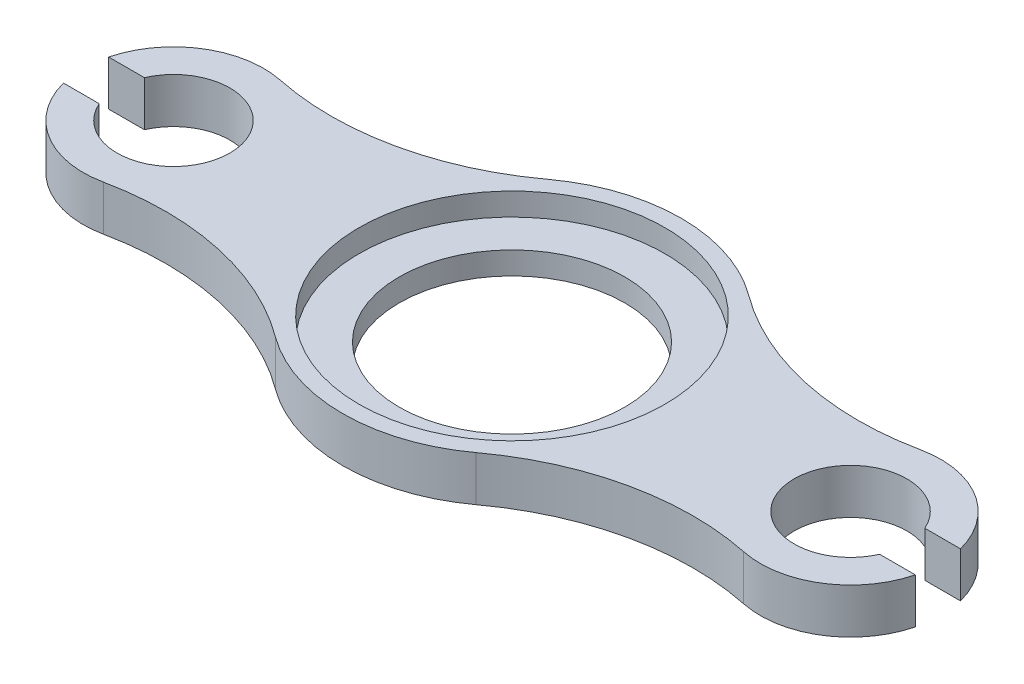
ISO-10303-21;
HEADER;
FILE_DESCRIPTION(('STEP AP214'),'2;1');
FILE_NAME('part.step','',(''),(''),'','','');
FILE_SCHEMA(('AUTOMOTIVE_DESIGN { 1 0 10303 214 1 1 1 1 }'));
ENDSEC;
DATA;
#1=APPLICATION_CONTEXT('core data for automotive mechanical design processes');
#2=APPLICATION_PROTOCOL_DEFINITION('international standard','automotive_design',2000,#1);
#3=PRODUCT_CONTEXT('',#1,'mechanical');
#4=PRODUCT('Part','Part','',(#3));
#5=PRODUCT_RELATED_PRODUCT_CATEGORY('part','',(#4));
#6=PRODUCT_DEFINITION_FORMATION('','',#4);
#7=PRODUCT_DEFINITION_CONTEXT('part definition',#1,'design');
#8=PRODUCT_DEFINITION('design','',#6,#7);
#9=PRODUCT_DEFINITION_SHAPE('','',#8);
#10=(LENGTH_UNIT() NAMED_UNIT(*) SI_UNIT(.MILLI.,.METRE.));
#11=(NAMED_UNIT(*) PLANE_ANGLE_UNIT() SI_UNIT($,.RADIAN.));
#12=(NAMED_UNIT(*) SI_UNIT($,.STERADIAN.) SOLID_ANGLE_UNIT());
#13=UNCERTAINTY_MEASURE_WITH_UNIT(LENGTH_MEASURE(1.E-05),#10,'distance_accuracy_value','');
#14=(GEOMETRIC_REPRESENTATION_CONTEXT(3) GLOBAL_UNCERTAINTY_ASSIGNED_CONTEXT((#13)) GLOBAL_UNIT_ASSIGNED_CONTEXT((#10,
#11,#12)) REPRESENTATION_CONTEXT('',''));
#15=CARTESIAN_POINT('',(0.,0.,0.));
#16=DIRECTION('',(0.,0.,1.));
#17=DIRECTION('',(1.,0.,0.));
#18=AXIS2_PLACEMENT_3D('',#15,#16,#17);
#19=CARTESIAN_POINT('',(-150.,20.,0.));
#20=DIRECTION('',(0.,-1.,0.));
#21=DIRECTION('',(0.,0.,-1.));
#22=AXIS2_PLACEMENT_3D('',#19,#20,#21);
#23=CYLINDRICAL_SURFACE('',#22,40.);
#24=CARTESIAN_POINT('',(-150.,0.,0.));
#25=DIRECTION('',(0.,1.,0.));
#26=DIRECTION('',(0.,0.,1.));
#27=AXIS2_PLACEMENT_3D('',#24,#25,#26);
#28=CIRCLE('',#27,40.);
#29=CARTESIAN_POINT('',(-141.825379967554,0.,-39.1557861282996));
#30=VERTEX_POINT('',#29);
#31=CARTESIAN_POINT('',(-188.729833462074,0.,-10.));
#32=VERTEX_POINT('',#31);
#33=EDGE_CURVE('E281',#30,#32,#28,.T.);
#34=ORIENTED_EDGE('',*,*,#33,.T.);
#35=DIRECTION('',(0.,-1.,0.));
#36=VECTOR('',#35,1.);
#37=CARTESIAN_POINT('',(-188.729833462074,20.,-10.));
#38=LINE('',#37,#36);
#39=CARTESIAN_POINT('',(-188.729833462074,20.,-10.));
#40=VERTEX_POINT('',#39);
#41=EDGE_CURVE('E99',#40,#32,#38,.T.);
#42=ORIENTED_EDGE('',*,*,#41,.F.);
#43=CARTESIAN_POINT('',(-150.,20.,0.));
#44=DIRECTION('',(0.,1.,0.));
#45=DIRECTION('',(0.,0.,1.));
#46=AXIS2_PLACEMENT_3D('',#43,#44,#45);
#47=CIRCLE('',#46,40.);
#48=CARTESIAN_POINT('',(-141.825379967554,20.,-39.1557861282996));
#49=VERTEX_POINT('',#48);
#50=EDGE_CURVE('E262',#49,#40,#47,.T.);
#51=ORIENTED_EDGE('',*,*,#50,.F.);
#52=DIRECTION('',(0.,-1.,0.));
#53=VECTOR('',#52,1.);
#54=CARTESIAN_POINT('',(-141.825379967554,20.,-39.1557861282996));
#55=LINE('',#54,#53);
#56=EDGE_CURVE('E12',#49,#30,#55,.T.);
#57=ORIENTED_EDGE('',*,*,#56,.T.);
#58=EDGE_LOOP('',(#34,#42,#51,#57));
#59=FACE_BOUND('',#58,.T.);
#60=ADVANCED_FACE('F89',(#59),#23,.T.);
#61=CARTESIAN_POINT('',(0.,20.,-10.));
#62=DIRECTION('',(0.,0.,-1.));
#63=DIRECTION('',(-1.,0.,0.));
#64=AXIS2_PLACEMENT_3D('',#61,#62,#63);
#65=PLANE('',#64);
#66=DIRECTION('',(1.,0.,0.));
#67=VECTOR('',#66,1.);
#68=CARTESIAN_POINT('',(0.,0.,-10.));
#69=LINE('',#68,#67);
#70=CARTESIAN_POINT('',(-172.912878474779,0.,-10.));
#71=VERTEX_POINT('',#70);
#72=EDGE_CURVE('E283',#32,#71,#69,.T.);
#73=ORIENTED_EDGE('',*,*,#72,.T.);
#74=DIRECTION('',(0.,-1.,0.));
#75=VECTOR('',#74,1.);
#76=CARTESIAN_POINT('',(-172.912878474779,20.,-10.));
#77=LINE('',#76,#75);
#78=CARTESIAN_POINT('',(-172.912878474779,20.,-10.));
#79=VERTEX_POINT('',#78);
#80=EDGE_CURVE('E306',#79,#71,#77,.T.);
#81=ORIENTED_EDGE('',*,*,#80,.F.);
#82=DIRECTION('',(1.,0.,0.));
#83=VECTOR('',#82,1.);
#84=CARTESIAN_POINT('',(0.,20.,-10.));
#85=LINE('',#84,#83);
#86=EDGE_CURVE('E266',#40,#79,#85,.T.);
#87=ORIENTED_EDGE('',*,*,#86,.F.);
#88=ORIENTED_EDGE('',*,*,#41,.T.);
#89=EDGE_LOOP('',(#73,#81,#87,#88));
#90=FACE_BOUND('',#89,.T.);
#91=ADVANCED_FACE('F375',(#90),#65,.F.);
#92=CARTESIAN_POINT('',(-150.,20.,0.));
#93=DIRECTION('',(0.,-1.,0.));
#94=DIRECTION('',(0.,0.,-1.));
#95=AXIS2_PLACEMENT_3D('',#92,#93,#94);
#96=CYLINDRICAL_SURFACE('',#95,25.);
#97=CARTESIAN_POINT('',(-150.,0.,0.));
#98=DIRECTION('',(0.,1.,0.));
#99=DIRECTION('',(0.,0.,1.));
#100=AXIS2_PLACEMENT_3D('',#97,#98,#99);
#101=CIRCLE('',#100,25.);
#102=CARTESIAN_POINT('',(-172.912878474779,0.,10.));
#103=VERTEX_POINT('',#102);
#104=EDGE_CURVE('E286',#103,#71,#101,.T.);
#105=ORIENTED_EDGE('',*,*,#104,.F.);
#106=DIRECTION('',(0.,-1.,0.));
#107=VECTOR('',#106,1.);
#108=CARTESIAN_POINT('',(-172.912878474779,20.,10.));
#109=LINE('',#108,#107);
#110=CARTESIAN_POINT('',(-172.912878474779,20.,10.));
#111=VERTEX_POINT('',#110);
#112=EDGE_CURVE('E304',#111,#103,#109,.T.);
#113=ORIENTED_EDGE('',*,*,#112,.F.);
#114=CARTESIAN_POINT('',(-150.,20.,0.));
#115=DIRECTION('',(0.,1.,0.));
#116=DIRECTION('',(0.,0.,1.));
#117=AXIS2_PLACEMENT_3D('',#114,#115,#116);
#118=CIRCLE('',#117,25.);
#119=EDGE_CURVE('E269',#111,#79,#118,.T.);
#120=ORIENTED_EDGE('',*,*,#119,.T.);
#121=ORIENTED_EDGE('',*,*,#80,.T.);
#122=EDGE_LOOP('',(#105,#113,#120,#121));
#123=FACE_BOUND('',#122,.T.);
#124=ADVANCED_FACE('F379',(#123),#96,.F.);
#125=CARTESIAN_POINT('',(0.,20.,10.));
#126=DIRECTION('',(0.,0.,-1.));
#127=DIRECTION('',(-1.,0.,0.));
#128=AXIS2_PLACEMENT_3D('',#125,#126,#127);
#129=PLANE('',#128);
#130=DIRECTION('',(1.,0.,0.));
#131=VECTOR('',#130,1.);
#132=CARTESIAN_POINT('',(0.,0.,10.));
#133=LINE('',#132,#131);
#134=CARTESIAN_POINT('',(-188.729833462074,0.,10.));
#135=VERTEX_POINT('',#134);
#136=EDGE_CURVE('E289',#135,#103,#133,.T.);
#137=ORIENTED_EDGE('',*,*,#136,.F.);
#138=DIRECTION('',(0.,-1.,0.));
#139=VECTOR('',#138,1.);
#140=CARTESIAN_POINT('',(-188.729833462074,20.,10.));
#141=LINE('',#140,#139);
#142=CARTESIAN_POINT('',(-188.729833462074,20.,10.));
#143=VERTEX_POINT('',#142);
#144=EDGE_CURVE('E302',#143,#135,#141,.T.);
#145=ORIENTED_EDGE('',*,*,#144,.F.);
#146=DIRECTION('',(1.,0.,0.));
#147=VECTOR('',#146,1.);
#148=CARTESIAN_POINT('',(0.,20.,10.));
#149=LINE('',#148,#147);
#150=EDGE_CURVE('E272',#143,#111,#149,.T.);
#151=ORIENTED_EDGE('',*,*,#150,.T.);
#152=ORIENTED_EDGE('',*,*,#112,.T.);
#153=EDGE_LOOP('',(#137,#145,#151,#152));
#154=FACE_BOUND('',#153,.T.);
#155=ADVANCED_FACE('F382',(#154),#129,.T.);
#156=CARTESIAN_POINT('',(-150.,20.,0.));
#157=DIRECTION('',(0.,-1.,0.));
#158=DIRECTION('',(0.,0.,-1.));
#159=AXIS2_PLACEMENT_3D('',#156,#157,#158);
#160=CYLINDRICAL_SURFACE('',#159,40.);
#161=CARTESIAN_POINT('',(-150.,0.,0.));
#162=DIRECTION('',(0.,1.,0.));
#163=DIRECTION('',(0.,0.,1.));
#164=AXIS2_PLACEMENT_3D('',#161,#162,#163);
#165=CIRCLE('',#164,40.);
#166=CARTESIAN_POINT('',(-141.825379967554,0.,39.1557861282996));
#167=VERTEX_POINT('',#166);
#168=EDGE_CURVE('E292',#135,#167,#165,.T.);
#169=ORIENTED_EDGE('',*,*,#168,.T.);
#170=DIRECTION('',(0.,-1.,0.));
#171=VECTOR('',#170,1.);
#172=CARTESIAN_POINT('',(-141.825379967554,20.,39.1557861282996));
#173=LINE('',#172,#171);
#174=CARTESIAN_POINT('',(-141.825379967554,20.,39.1557861282996));
#175=VERTEX_POINT('',#174);
#176=EDGE_CURVE('E299',#175,#167,#173,.T.);
#177=ORIENTED_EDGE('',*,*,#176,.F.);
#178=CARTESIAN_POINT('',(-150.,20.,0.));
#179=DIRECTION('',(0.,1.,0.));
#180=DIRECTION('',(0.,0.,1.));
#181=AXIS2_PLACEMENT_3D('',#178,#179,#180);
#182=CIRCLE('',#181,40.);
#183=EDGE_CURVE('E275',#143,#175,#182,.T.);
#184=ORIENTED_EDGE('',*,*,#183,.F.);
#185=ORIENTED_EDGE('',*,*,#144,.T.);
#186=EDGE_LOOP('',(#169,#177,#184,#185));
#187=FACE_BOUND('',#186,.T.);
#188=ADVANCED_FACE('F385',(#187),#160,.T.);
#189=CARTESIAN_POINT('',(-116.888373994603,20.,158.602080718323));
#190=DIRECTION('',(0.,-1.,0.));
#191=DIRECTION('',(0.,0.,-1.));
#192=AXIS2_PLACEMENT_3D('',#189,#190,#191);
#193=CYLINDRICAL_SURFACE('',#192,122.021602834014);
#194=CARTESIAN_POINT('',(-116.888373994603,0.,158.602080718323));
#195=DIRECTION('',(0.,1.,0.));
#196=DIRECTION('',(0.,0.,1.));
#197=AXIS2_PLACEMENT_3D('',#194,#195,#196);
#198=CIRCLE('',#197,122.021602834014);
#199=CARTESIAN_POINT('',(-44.4957706337458,0.,60.3748821589664));
#200=VERTEX_POINT('',#199);
#201=EDGE_CURVE('E263',#167,#200,#198,.F.);
#202=ORIENTED_EDGE('',*,*,#201,.T.);
#203=DIRECTION('',(0.,-1.,0.));
#204=VECTOR('',#203,1.);
#205=CARTESIAN_POINT('',(-44.4957706337458,20.,60.3748821589664));
#206=LINE('',#205,#204);
#207=CARTESIAN_POINT('',(-44.4957706337458,20.,60.3748821589664));
#208=VERTEX_POINT('',#207);
#209=EDGE_CURVE('E297',#208,#200,#206,.T.);
#210=ORIENTED_EDGE('',*,*,#209,.F.);
#211=CARTESIAN_POINT('',(-116.888373994603,20.,158.602080718323));
#212=DIRECTION('',(0.,1.,0.));
#213=DIRECTION('',(0.,0.,1.));
#214=AXIS2_PLACEMENT_3D('',#211,#212,#213);
#215=CIRCLE('',#214,122.021602834014);
#216=EDGE_CURVE('E278',#175,#208,#215,.F.);
#217=ORIENTED_EDGE('',*,*,#216,.F.);
#218=ORIENTED_EDGE('',*,*,#176,.T.);
#219=EDGE_LOOP('',(#202,#210,#217,#218));
#220=FACE_BOUND('',#219,.T.);
#221=ADVANCED_FACE('F351',(#220),#193,.F.);
#222=CARTESIAN_POINT('',(-116.888373994603,20.,-158.602080718323));
#223=DIRECTION('',(0.,-1.,0.));
#224=DIRECTION('',(0.,0.,-1.));
#225=AXIS2_PLACEMENT_3D('',#222,#223,#224);
#226=CYLINDRICAL_SURFACE('',#225,122.021602834014);
#227=CARTESIAN_POINT('',(-116.888373994603,0.,-158.602080718323));
#228=DIRECTION('',(0.,1.,0.));
#229=DIRECTION('',(0.,0.,1.));
#230=AXIS2_PLACEMENT_3D('',#227,#228,#229);
#231=CIRCLE('',#230,122.021602834014);
#232=CARTESIAN_POINT('',(-44.4957706337458,0.,-60.3748821589664));
#233=VERTEX_POINT('',#232);
#234=EDGE_CURVE('E235',#30,#233,#231,.T.);
#235=ORIENTED_EDGE('',*,*,#234,.F.);
#236=ORIENTED_EDGE('',*,*,#56,.F.);
#237=CARTESIAN_POINT('',(-116.888373994603,20.,-158.602080718323));
#238=DIRECTION('',(0.,1.,0.));
#239=DIRECTION('',(0.,0.,1.));
#240=AXIS2_PLACEMENT_3D('',#237,#238,#239);
#241=CIRCLE('',#240,122.021602834014);
#242=CARTESIAN_POINT('',(-44.4957706337458,20.,-60.3748821589664));
#243=VERTEX_POINT('',#242);
#244=EDGE_CURVE('E260',#49,#243,#241,.T.);
#245=ORIENTED_EDGE('',*,*,#244,.T.);
#246=DIRECTION('',(0.,-1.,0.));
#247=VECTOR('',#246,1.);
#248=CARTESIAN_POINT('',(-44.4957706337458,20.,-60.3748821589664));
#249=LINE('',#248,#247);
#250=EDGE_CURVE('E108',#243,#233,#249,.T.);
#251=ORIENTED_EDGE('',*,*,#250,.T.);
#252=EDGE_LOOP('',(#235,#236,#245,#251));
#253=FACE_BOUND('',#252,.T.);
#254=ADVANCED_FACE('F367',(#253),#226,.F.);
#255=CARTESIAN_POINT('',(0.,0.,0.));
#256=DIRECTION('',(0.,1.,0.));
#257=DIRECTION('',(0.,0.,1.));
#258=AXIS2_PLACEMENT_3D('',#255,#256,#257);
#259=PLANE('',#258);
#260=CARTESIAN_POINT('',(0.,0.,0.));
#261=DIRECTION('',(0.,1.,0.));
#262=DIRECTION('',(0.,0.,1.));
#263=AXIS2_PLACEMENT_3D('',#260,#261,#262);
#264=CIRCLE('',#263,50.);
#265=CARTESIAN_POINT('',(0.,0.,50.));
#266=VERTEX_POINT('',#265);
#267=EDGE_CURVE('E567',#266,#266,#264,.T.);
#268=ORIENTED_EDGE('',*,*,#267,.T.);
#269=EDGE_LOOP('',(#268));
#270=FACE_BOUND('',#269,.T.);
#271=ORIENTED_EDGE('',*,*,#234,.T.);
#272=CARTESIAN_POINT('',(0.,0.,0.));
#273=DIRECTION('',(0.,1.,0.));
#274=DIRECTION('',(0.,0.,1.));
#275=AXIS2_PLACEMENT_3D('',#272,#273,#274);
#276=CIRCLE('',#275,75.);
#277=CARTESIAN_POINT('',(44.4957706337458,0.,-60.3748821589664));
#278=VERTEX_POINT('',#277);
#279=EDGE_CURVE('E93',#278,#233,#276,.T.);
#280=ORIENTED_EDGE('',*,*,#279,.F.);
#281=CARTESIAN_POINT('',(116.888373994603,0.,-158.602080718323));
#282=DIRECTION('',(0.,1.,0.));
#283=DIRECTION('',(0.,0.,1.));
#284=AXIS2_PLACEMENT_3D('',#281,#282,#283);
#285=CIRCLE('',#284,122.021602834014);
#286=CARTESIAN_POINT('',(141.825379967554,0.,-39.1557861282996));
#287=VERTEX_POINT('',#286);
#288=EDGE_CURVE('E209',#287,#278,#285,.F.);
#289=ORIENTED_EDGE('',*,*,#288,.F.);
#290=CARTESIAN_POINT('',(150.,0.,0.));
#291=DIRECTION('',(0.,1.,0.));
#292=DIRECTION('',(0.,0.,1.));
#293=AXIS2_PLACEMENT_3D('',#290,#291,#292);
#294=CIRCLE('',#293,40.);
#295=CARTESIAN_POINT('',(188.729833462074,0.,-10.0000000000001));
#296=VERTEX_POINT('',#295);
#297=EDGE_CURVE('E194',#287,#296,#294,.F.);
#298=ORIENTED_EDGE('',*,*,#297,.T.);
#299=DIRECTION('',(-1.,0.,0.));
#300=VECTOR('',#299,1.);
#301=CARTESIAN_POINT('',(0.,0.,-10.0000000000001));
#302=LINE('',#301,#300);
#303=CARTESIAN_POINT('',(172.912878474779,0.,-10.0000000000001));
#304=VERTEX_POINT('',#303);
#305=EDGE_CURVE('E206',#296,#304,#302,.T.);
#306=ORIENTED_EDGE('',*,*,#305,.T.);
#307=CARTESIAN_POINT('',(150.,0.,0.));
#308=DIRECTION('',(0.,1.,0.));
#309=DIRECTION('',(0.,0.,1.));
#310=AXIS2_PLACEMENT_3D('',#307,#308,#309);
#311=CIRCLE('',#310,25.);
#312=CARTESIAN_POINT('',(172.912878474779,0.,9.99999999999994));
#313=VERTEX_POINT('',#312);
#314=EDGE_CURVE('E213',#313,#304,#311,.F.);
#315=ORIENTED_EDGE('',*,*,#314,.F.);
#316=DIRECTION('',(-1.,0.,0.));
#317=VECTOR('',#316,1.);
#318=CARTESIAN_POINT('',(0.,0.,9.99999999999994));
#319=LINE('',#318,#317);
#320=CARTESIAN_POINT('',(188.729833462074,0.,9.99999999999994));
#321=VERTEX_POINT('',#320);
#322=EDGE_CURVE('E217',#321,#313,#319,.T.);
#323=ORIENTED_EDGE('',*,*,#322,.F.);
#324=CARTESIAN_POINT('',(150.,0.,0.));
#325=DIRECTION('',(0.,1.,0.));
#326=DIRECTION('',(0.,0.,1.));
#327=AXIS2_PLACEMENT_3D('',#324,#325,#326);
#328=CIRCLE('',#327,40.);
#329=CARTESIAN_POINT('',(141.825379967554,0.,39.1557861282996));
#330=VERTEX_POINT('',#329);
#331=EDGE_CURVE('E326',#321,#330,#328,.F.);
#332=ORIENTED_EDGE('',*,*,#331,.T.);
#333=CARTESIAN_POINT('',(116.888373994603,0.,158.602080718323));
#334=DIRECTION('',(0.,1.,0.));
#335=DIRECTION('',(0.,0.,1.));
#336=AXIS2_PLACEMENT_3D('',#333,#334,#335);
#337=CIRCLE('',#336,122.021602834014);
#338=CARTESIAN_POINT('',(44.4957706337458,0.,60.3748821589664));
#339=VERTEX_POINT('',#338);
#340=EDGE_CURVE('E323',#330,#339,#337,.T.);
#341=ORIENTED_EDGE('',*,*,#340,.T.);
#342=EDGE_CURVE('E245',#200,#339,#276,.T.);
#343=ORIENTED_EDGE('',*,*,#342,.F.);
#344=ORIENTED_EDGE('',*,*,#201,.F.);
#345=ORIENTED_EDGE('',*,*,#168,.F.);
#346=ORIENTED_EDGE('',*,*,#136,.T.);
#347=ORIENTED_EDGE('',*,*,#104,.T.);
#348=ORIENTED_EDGE('',*,*,#72,.F.);
#349=ORIENTED_EDGE('',*,*,#33,.F.);
#350=EDGE_LOOP('',(#271,#280,#289,#298,#306,#315,#323,#332,#341,#343,#344,#345,#346,#347,#348,#349));
#351=FACE_BOUND('',#350,.T.);
#352=ADVANCED_FACE('F204',(#270,#351),#259,.F.);
#353=CARTESIAN_POINT('',(0.,20.,0.));
#354=DIRECTION('',(0.,1.,0.));
#355=DIRECTION('',(0.,0.,1.));
#356=AXIS2_PLACEMENT_3D('',#353,#354,#355);
#357=PLANE('',#356);
#358=CARTESIAN_POINT('',(0.,20.,0.));
#359=DIRECTION('',(0.,1.,0.));
#360=DIRECTION('',(0.,0.,1.));
#361=AXIS2_PLACEMENT_3D('',#358,#359,#360);
#362=CIRCLE('',#361,67.8);
#363=CARTESIAN_POINT('',(0.,20.,67.8));
#364=VERTEX_POINT('',#363);
#365=EDGE_CURVE('E250',#364,#364,#362,.T.);
#366=ORIENTED_EDGE('',*,*,#365,.F.);
#367=EDGE_LOOP('',(#366));
#368=FACE_BOUND('',#367,.T.);
#369=ORIENTED_EDGE('',*,*,#244,.F.);
#370=ORIENTED_EDGE('',*,*,#50,.T.);
#371=ORIENTED_EDGE('',*,*,#86,.T.);
#372=ORIENTED_EDGE('',*,*,#119,.F.);
#373=ORIENTED_EDGE('',*,*,#150,.F.);
#374=ORIENTED_EDGE('',*,*,#183,.T.);
#375=ORIENTED_EDGE('',*,*,#216,.T.);
#376=CARTESIAN_POINT('',(0.,20.,0.));
#377=DIRECTION('',(0.,1.,0.));
#378=DIRECTION('',(0.,0.,1.));
#379=AXIS2_PLACEMENT_3D('',#376,#377,#378);
#380=CIRCLE('',#379,75.);
#381=CARTESIAN_POINT('',(44.4957706337458,20.,60.3748821589664));
#382=VERTEX_POINT('',#381);
#383=EDGE_CURVE('E236',#208,#382,#380,.T.);
#384=ORIENTED_EDGE('',*,*,#383,.T.);
#385=CARTESIAN_POINT('',(116.888373994603,20.,158.602080718323));
#386=DIRECTION('',(0.,1.,0.));
#387=DIRECTION('',(0.,0.,1.));
#388=AXIS2_PLACEMENT_3D('',#385,#386,#387);
#389=CIRCLE('',#388,122.021602834014);
#390=CARTESIAN_POINT('',(141.825379967554,20.,39.1557861282996));
#391=VERTEX_POINT('',#390);
#392=EDGE_CURVE('E311',#391,#382,#389,.T.);
#393=ORIENTED_EDGE('',*,*,#392,.F.);
#394=CARTESIAN_POINT('',(150.,20.,0.));
#395=DIRECTION('',(0.,1.,0.));
#396=DIRECTION('',(0.,0.,1.));
#397=AXIS2_PLACEMENT_3D('',#394,#395,#396);
#398=CIRCLE('',#397,40.);
#399=CARTESIAN_POINT('',(188.729833462074,20.,9.99999999999994));
#400=VERTEX_POINT('',#399);
#401=EDGE_CURVE('E314',#400,#391,#398,.F.);
#402=ORIENTED_EDGE('',*,*,#401,.F.);
#403=DIRECTION('',(-1.,0.,0.));
#404=VECTOR('',#403,1.);
#405=CARTESIAN_POINT('',(0.,20.,9.99999999999994));
#406=LINE('',#405,#404);
#407=CARTESIAN_POINT('',(172.912878474779,20.,9.99999999999994));
#408=VERTEX_POINT('',#407);
#409=EDGE_CURVE('E317',#400,#408,#406,.T.);
#410=ORIENTED_EDGE('',*,*,#409,.T.);
#411=CARTESIAN_POINT('',(150.,20.,0.));
#412=DIRECTION('',(0.,1.,0.));
#413=DIRECTION('',(0.,0.,1.));
#414=AXIS2_PLACEMENT_3D('',#411,#412,#413);
#415=CIRCLE('',#414,25.);
#416=CARTESIAN_POINT('',(172.912878474779,20.,-10.0000000000001));
#417=VERTEX_POINT('',#416);
#418=EDGE_CURVE('E319',#408,#417,#415,.F.);
#419=ORIENTED_EDGE('',*,*,#418,.T.);
#420=DIRECTION('',(-1.,0.,0.));
#421=VECTOR('',#420,1.);
#422=CARTESIAN_POINT('',(0.,20.,-10.0000000000001));
#423=LINE('',#422,#421);
#424=CARTESIAN_POINT('',(188.729833462074,20.,-10.0000000000001));
#425=VERTEX_POINT('',#424);
#426=EDGE_CURVE('E198',#425,#417,#423,.T.);
#427=ORIENTED_EDGE('',*,*,#426,.F.);
#428=CARTESIAN_POINT('',(150.,20.,0.));
#429=DIRECTION('',(0.,1.,0.));
#430=DIRECTION('',(0.,0.,1.));
#431=AXIS2_PLACEMENT_3D('',#428,#429,#430);
#432=CIRCLE('',#431,40.);
#433=CARTESIAN_POINT('',(141.825379967554,20.,-39.1557861282996));
#434=VERTEX_POINT('',#433);
#435=EDGE_CURVE('E196',#434,#425,#432,.F.);
#436=ORIENTED_EDGE('',*,*,#435,.F.);
#437=CARTESIAN_POINT('',(116.888373994603,20.,-158.602080718323));
#438=DIRECTION('',(0.,1.,0.));
#439=DIRECTION('',(0.,0.,1.));
#440=AXIS2_PLACEMENT_3D('',#437,#438,#439);
#441=CIRCLE('',#440,122.021602834014);
#442=CARTESIAN_POINT('',(44.4957706337458,20.,-60.3748821589664));
#443=VERTEX_POINT('',#442);
#444=EDGE_CURVE('E215',#434,#443,#441,.F.);
#445=ORIENTED_EDGE('',*,*,#444,.T.);
#446=EDGE_CURVE('E210',#443,#243,#380,.T.);
#447=ORIENTED_EDGE('',*,*,#446,.T.);
#448=EDGE_LOOP('',(#369,#370,#371,#372,#373,#374,#375,#384,#393,#402,#410,#419,#427,#436,#445,#447));
#449=FACE_BOUND('',#448,.T.);
#450=ADVANCED_FACE('F337',(#368,#449),#357,.T.);
#451=CARTESIAN_POINT('',(150.,20.,0.));
#452=DIRECTION('',(0.,-1.,0.));
#453=DIRECTION('',(0.,0.,-1.));
#454=AXIS2_PLACEMENT_3D('',#451,#452,#453);
#455=CYLINDRICAL_SURFACE('',#454,40.);
#456=ORIENTED_EDGE('',*,*,#331,.F.);
#457=DIRECTION('',(0.,-1.,0.));
#458=VECTOR('',#457,1.);
#459=CARTESIAN_POINT('',(188.729833462074,20.,9.99999999999994));
#460=LINE('',#459,#458);
#461=EDGE_CURVE('E225',#400,#321,#460,.T.);
#462=ORIENTED_EDGE('',*,*,#461,.F.);
#463=ORIENTED_EDGE('',*,*,#401,.T.);
#464=DIRECTION('',(0.,-1.,0.));
#465=VECTOR('',#464,1.);
#466=CARTESIAN_POINT('',(141.825379967554,20.,39.1557861282996));
#467=LINE('',#466,#465);
#468=EDGE_CURVE('E227',#391,#330,#467,.T.);
#469=ORIENTED_EDGE('',*,*,#468,.T.);
#470=EDGE_LOOP('',(#456,#462,#463,#469));
#471=FACE_BOUND('',#470,.T.);
#472=ADVANCED_FACE('F340',(#471),#455,.T.);
#473=CARTESIAN_POINT('',(0.,20.,9.99999999999994));
#474=DIRECTION('',(0.,0.,1.));
#475=DIRECTION('',(1.,0.,0.));
#476=AXIS2_PLACEMENT_3D('',#473,#474,#475);
#477=PLANE('',#476);
#478=ORIENTED_EDGE('',*,*,#322,.T.);
#479=DIRECTION('',(0.,-1.,0.));
#480=VECTOR('',#479,1.);
#481=CARTESIAN_POINT('',(172.912878474779,20.,9.99999999999994));
#482=LINE('',#481,#480);
#483=EDGE_CURVE('E222',#408,#313,#482,.T.);
#484=ORIENTED_EDGE('',*,*,#483,.F.);
#485=ORIENTED_EDGE('',*,*,#409,.F.);
#486=ORIENTED_EDGE('',*,*,#461,.T.);
#487=EDGE_LOOP('',(#478,#484,#485,#486));
#488=FACE_BOUND('',#487,.T.);
#489=ADVANCED_FACE('F331',(#488),#477,.F.);
#490=CARTESIAN_POINT('',(150.,20.,0.));
#491=DIRECTION('',(0.,-1.,0.));
#492=DIRECTION('',(0.,0.,-1.));
#493=AXIS2_PLACEMENT_3D('',#490,#491,#492);
#494=CYLINDRICAL_SURFACE('',#493,25.);
#495=ORIENTED_EDGE('',*,*,#314,.T.);
#496=DIRECTION('',(0.,-1.,0.));
#497=VECTOR('',#496,1.);
#498=CARTESIAN_POINT('',(172.912878474779,20.,-10.0000000000001));
#499=LINE('',#498,#497);
#500=EDGE_CURVE('E185',#417,#304,#499,.T.);
#501=ORIENTED_EDGE('',*,*,#500,.F.);
#502=ORIENTED_EDGE('',*,*,#418,.F.);
#503=ORIENTED_EDGE('',*,*,#483,.T.);
#504=EDGE_LOOP('',(#495,#501,#502,#503));
#505=FACE_BOUND('',#504,.T.);
#506=ADVANCED_FACE('F336',(#505),#494,.F.);
#507=CARTESIAN_POINT('',(0.,20.,-10.0000000000001));
#508=DIRECTION('',(0.,0.,1.));
#509=DIRECTION('',(1.,0.,0.));
#510=AXIS2_PLACEMENT_3D('',#507,#508,#509);
#511=PLANE('',#510);
#512=ORIENTED_EDGE('',*,*,#305,.F.);
#513=DIRECTION('',(0.,-1.,0.));
#514=VECTOR('',#513,1.);
#515=CARTESIAN_POINT('',(188.729833462074,20.,-10.0000000000001));
#516=LINE('',#515,#514);
#517=EDGE_CURVE('E191',#425,#296,#516,.T.);
#518=ORIENTED_EDGE('',*,*,#517,.F.);
#519=ORIENTED_EDGE('',*,*,#426,.T.);
#520=ORIENTED_EDGE('',*,*,#500,.T.);
#521=EDGE_LOOP('',(#512,#518,#519,#520));
#522=FACE_BOUND('',#521,.T.);
#523=ADVANCED_FACE('F212',(#522),#511,.T.);
#524=CARTESIAN_POINT('',(150.,20.,0.));
#525=DIRECTION('',(0.,-1.,0.));
#526=DIRECTION('',(0.,0.,-1.));
#527=AXIS2_PLACEMENT_3D('',#524,#525,#526);
#528=CYLINDRICAL_SURFACE('',#527,40.);
#529=ORIENTED_EDGE('',*,*,#297,.F.);
#530=DIRECTION('',(0.,-1.,0.));
#531=VECTOR('',#530,1.);
#532=CARTESIAN_POINT('',(141.825379967554,20.,-39.1557861282996));
#533=LINE('',#532,#531);
#534=EDGE_CURVE('E234',#434,#287,#533,.T.);
#535=ORIENTED_EDGE('',*,*,#534,.F.);
#536=ORIENTED_EDGE('',*,*,#435,.T.);
#537=ORIENTED_EDGE('',*,*,#517,.T.);
#538=EDGE_LOOP('',(#529,#535,#536,#537));
#539=FACE_BOUND('',#538,.T.);
#540=ADVANCED_FACE('F193',(#539),#528,.T.);
#541=CARTESIAN_POINT('',(116.888373994603,20.,-158.602080718323));
#542=DIRECTION('',(0.,-1.,0.));
#543=DIRECTION('',(0.,0.,-1.));
#544=AXIS2_PLACEMENT_3D('',#541,#542,#543);
#545=CYLINDRICAL_SURFACE('',#544,122.021602834014);
#546=ORIENTED_EDGE('',*,*,#288,.T.);
#547=DIRECTION('',(0.,-1.,0.));
#548=VECTOR('',#547,1.);
#549=CARTESIAN_POINT('',(44.4957706337458,20.,-60.3748821589664));
#550=LINE('',#549,#548);
#551=EDGE_CURVE('E232',#443,#278,#550,.T.);
#552=ORIENTED_EDGE('',*,*,#551,.F.);
#553=ORIENTED_EDGE('',*,*,#444,.F.);
#554=ORIENTED_EDGE('',*,*,#534,.T.);
#555=EDGE_LOOP('',(#546,#552,#553,#554));
#556=FACE_BOUND('',#555,.T.);
#557=ADVANCED_FACE('F387',(#556),#545,.F.);
#558=CARTESIAN_POINT('',(116.888373994603,20.,158.602080718323));
#559=DIRECTION('',(0.,-1.,0.));
#560=DIRECTION('',(0.,0.,-1.));
#561=AXIS2_PLACEMENT_3D('',#558,#559,#560);
#562=CYLINDRICAL_SURFACE('',#561,122.021602834014);
#563=ORIENTED_EDGE('',*,*,#340,.F.);
#564=ORIENTED_EDGE('',*,*,#468,.F.);
#565=ORIENTED_EDGE('',*,*,#392,.T.);
#566=DIRECTION('',(0.,-1.,0.));
#567=VECTOR('',#566,1.);
#568=CARTESIAN_POINT('',(44.4957706337458,20.,60.3748821589664));
#569=LINE('',#568,#567);
#570=EDGE_CURVE('E229',#382,#339,#569,.T.);
#571=ORIENTED_EDGE('',*,*,#570,.T.);
#572=EDGE_LOOP('',(#563,#564,#565,#571));
#573=FACE_BOUND('',#572,.T.);
#574=ADVANCED_FACE('F344',(#573),#562,.F.);
#575=CARTESIAN_POINT('',(0.,20.,0.));
#576=DIRECTION('',(0.,-1.,0.));
#577=DIRECTION('',(0.,0.,-1.));
#578=AXIS2_PLACEMENT_3D('',#575,#576,#577);
#579=CYLINDRICAL_SURFACE('',#578,75.);
#580=ORIENTED_EDGE('',*,*,#250,.F.);
#581=ORIENTED_EDGE('',*,*,#446,.F.);
#582=ORIENTED_EDGE('',*,*,#551,.T.);
#583=ORIENTED_EDGE('',*,*,#279,.T.);
#584=EDGE_LOOP('',(#580,#581,#582,#583));
#585=FACE_BOUND('',#584,.T.);
#586=ADVANCED_FACE('F91',(#585),#579,.T.);
#587=ORIENTED_EDGE('',*,*,#383,.F.);
#588=ORIENTED_EDGE('',*,*,#209,.T.);
#589=ORIENTED_EDGE('',*,*,#342,.T.);
#590=ORIENTED_EDGE('',*,*,#570,.F.);
#591=EDGE_LOOP('',(#587,#588,#589,#590));
#592=FACE_BOUND('',#591,.T.);
#593=ADVANCED_FACE('F345',(#592),#579,.T.);
#594=CARTESIAN_POINT('',(0.,10.,0.));
#595=DIRECTION('',(0.,1.,0.));
#596=DIRECTION('',(0.,0.,1.));
#597=AXIS2_PLACEMENT_3D('',#594,#595,#596);
#598=CYLINDRICAL_SURFACE('',#597,67.8);
#599=CARTESIAN_POINT('',(0.,10.,0.));
#600=DIRECTION('',(0.,1.,0.));
#601=DIRECTION('',(0.,0.,1.));
#602=AXIS2_PLACEMENT_3D('',#599,#600,#601);
#603=CIRCLE('',#602,67.8);
#604=CARTESIAN_POINT('',(0.,10.,67.8));
#605=VERTEX_POINT('',#604);
#606=EDGE_CURVE('E246',#605,#605,#603,.T.);
#607=ORIENTED_EDGE('',*,*,#606,.F.);
#608=EDGE_LOOP('',(#607));
#609=FACE_BOUND('',#608,.T.);
#610=ORIENTED_EDGE('',*,*,#365,.T.);
#611=EDGE_LOOP('',(#610));
#612=FACE_BOUND('',#611,.T.);
#613=ADVANCED_FACE('F390',(#609,#612),#598,.F.);
#614=CARTESIAN_POINT('',(0.,10.,0.));
#615=DIRECTION('',(0.,1.,0.));
#616=DIRECTION('',(0.,0.,1.));
#617=AXIS2_PLACEMENT_3D('',#614,#615,#616);
#618=PLANE('',#617);
#619=CARTESIAN_POINT('',(0.,10.,0.));
#620=DIRECTION('',(0.,1.,0.));
#621=DIRECTION('',(0.,0.,1.));
#622=AXIS2_PLACEMENT_3D('',#619,#620,#621);
#623=CIRCLE('',#622,50.);
#624=CARTESIAN_POINT('',(0.,10.,50.));
#625=VERTEX_POINT('',#624);
#626=EDGE_CURVE('E255',#625,#625,#623,.T.);
#627=ORIENTED_EDGE('',*,*,#626,.F.);
#628=EDGE_LOOP('',(#627));
#629=FACE_BOUND('',#628,.T.);
#630=ORIENTED_EDGE('',*,*,#606,.T.);
#631=EDGE_LOOP('',(#630));
#632=FACE_BOUND('',#631,.T.);
#633=ADVANCED_FACE('F397',(#629,#632),#618,.T.);
#634=CARTESIAN_POINT('',(0.,0.,0.));
#635=DIRECTION('',(0.,1.,0.));
#636=DIRECTION('',(0.,0.,1.));
#637=AXIS2_PLACEMENT_3D('',#634,#635,#636);
#638=CYLINDRICAL_SURFACE('',#637,50.);
#639=ORIENTED_EDGE('',*,*,#626,.T.);
#640=EDGE_LOOP('',(#639));
#641=FACE_BOUND('',#640,.T.);
#642=ORIENTED_EDGE('',*,*,#267,.F.);
#643=EDGE_LOOP('',(#642));
#644=FACE_BOUND('',#643,.T.);
#645=ADVANCED_FACE('F465',(#641,#644),#638,.F.);
#646=CLOSED_SHELL('',(#60,#91,#124,#155,#188,#221,#254,#352,#450,#472,#489,#506,#523,#540,#557,
#574,#586,#593,#613,#633,#645));
#647=MANIFOLD_SOLID_BREP('B2',#646);
#648=ADVANCED_BREP_SHAPE_REPRESENTATION('',(#18,#647),#14);
#649=SHAPE_DEFINITION_REPRESENTATION(#9,#648);
ENDSEC;
END-ISO-10303-21;
